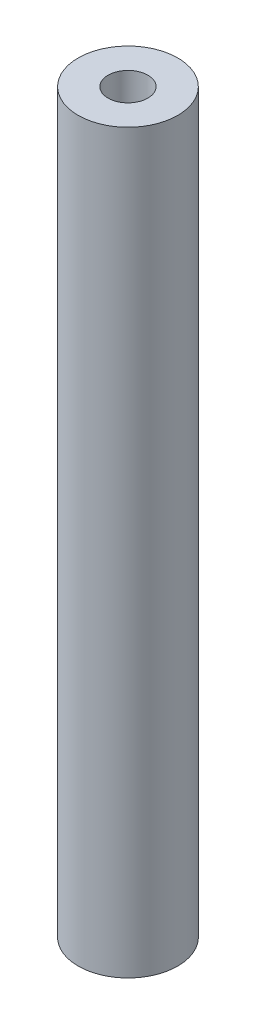
ISO-10303-21;
HEADER;
FILE_DESCRIPTION(('STEP AP214'),'2;1');
FILE_NAME('part.step','',(''),(''),'','','');
FILE_SCHEMA(('AUTOMOTIVE_DESIGN { 1 0 10303 214 1 1 1 1 }'));
ENDSEC;
DATA;
#1=APPLICATION_CONTEXT('core data for automotive mechanical design processes');
#2=APPLICATION_PROTOCOL_DEFINITION('international standard','automotive_design',2000,#1);
#3=PRODUCT_CONTEXT('',#1,'mechanical');
#4=PRODUCT('Part','Part','',(#3));
#5=PRODUCT_RELATED_PRODUCT_CATEGORY('part','',(#4));
#6=PRODUCT_DEFINITION_FORMATION('','',#4);
#7=PRODUCT_DEFINITION_CONTEXT('part definition',#1,'design');
#8=PRODUCT_DEFINITION('design','',#6,#7);
#9=PRODUCT_DEFINITION_SHAPE('','',#8);
#10=(LENGTH_UNIT() NAMED_UNIT(*) SI_UNIT(.MILLI.,.METRE.));
#11=(NAMED_UNIT(*) PLANE_ANGLE_UNIT() SI_UNIT($,.RADIAN.));
#12=(NAMED_UNIT(*) SI_UNIT($,.STERADIAN.) SOLID_ANGLE_UNIT());
#13=UNCERTAINTY_MEASURE_WITH_UNIT(LENGTH_MEASURE(1.E-05),#10,'distance_accuracy_value','');
#14=(GEOMETRIC_REPRESENTATION_CONTEXT(3) GLOBAL_UNCERTAINTY_ASSIGNED_CONTEXT((#13)) GLOBAL_UNIT_ASSIGNED_CONTEXT((#10,
#11,#12)) REPRESENTATION_CONTEXT('',''));
#15=CARTESIAN_POINT('',(0.,0.,0.));
#16=DIRECTION('',(0.,0.,1.));
#17=DIRECTION('',(1.,0.,0.));
#18=AXIS2_PLACEMENT_3D('',#15,#16,#17);
#19=CARTESIAN_POINT('',(0.,74.,0.));
#20=DIRECTION('',(0.,-1.,0.));
#21=DIRECTION('',(0.,0.,-1.));
#22=AXIS2_PLACEMENT_3D('',#19,#20,#21);
#23=CYLINDRICAL_SURFACE('',#22,5.);
#24=CARTESIAN_POINT('',(0.,74.,0.));
#25=DIRECTION('',(0.,1.,0.));
#26=DIRECTION('',(0.,0.,1.));
#27=AXIS2_PLACEMENT_3D('',#24,#25,#26);
#28=CIRCLE('',#27,5.);
#29=CARTESIAN_POINT('',(0.,74.,5.));
#30=VERTEX_POINT('',#29);
#31=EDGE_CURVE('E10',#30,#30,#28,.T.);
#32=ORIENTED_EDGE('',*,*,#31,.F.);
#33=EDGE_LOOP('',(#32));
#34=FACE_BOUND('',#33,.T.);
#35=CARTESIAN_POINT('',(0.,0.,0.));
#36=DIRECTION('',(0.,1.,0.));
#37=DIRECTION('',(0.,0.,1.));
#38=AXIS2_PLACEMENT_3D('',#35,#36,#37);
#39=CIRCLE('',#38,5.);
#40=CARTESIAN_POINT('',(0.,0.,5.));
#41=VERTEX_POINT('',#40);
#42=EDGE_CURVE('E34',#41,#41,#39,.T.);
#43=ORIENTED_EDGE('',*,*,#42,.T.);
#44=EDGE_LOOP('',(#43));
#45=FACE_BOUND('',#44,.T.);
#46=ADVANCED_FACE('F31',(#34,#45),#23,.T.);
#47=CARTESIAN_POINT('',(0.,74.,0.));
#48=DIRECTION('',(0.,1.,0.));
#49=DIRECTION('',(0.,0.,1.));
#50=AXIS2_PLACEMENT_3D('',#47,#48,#49);
#51=PLANE('',#50);
#52=CARTESIAN_POINT('',(0.,74.,0.));
#53=DIRECTION('',(0.,1.,0.));
#54=DIRECTION('',(0.,0.,1.));
#55=AXIS2_PLACEMENT_3D('',#52,#53,#54);
#56=CIRCLE('',#55,2.);
#57=CARTESIAN_POINT('',(0.,74.,2.));
#58=VERTEX_POINT('',#57);
#59=EDGE_CURVE('E45',#58,#58,#56,.T.);
#60=ORIENTED_EDGE('',*,*,#59,.F.);
#61=EDGE_LOOP('',(#60));
#62=FACE_BOUND('',#61,.T.);
#63=ORIENTED_EDGE('',*,*,#31,.T.);
#64=EDGE_LOOP('',(#63));
#65=FACE_BOUND('',#64,.T.);
#66=ADVANCED_FACE('F52',(#62,#65),#51,.T.);
#67=CARTESIAN_POINT('',(0.,0.,0.));
#68=DIRECTION('',(0.,1.,0.));
#69=DIRECTION('',(0.,0.,1.));
#70=AXIS2_PLACEMENT_3D('',#67,#68,#69);
#71=PLANE('',#70);
#72=CARTESIAN_POINT('',(0.,0.,0.));
#73=DIRECTION('',(0.,1.,0.));
#74=DIRECTION('',(0.,0.,1.));
#75=AXIS2_PLACEMENT_3D('',#72,#73,#74);
#76=CIRCLE('',#75,2.);
#77=CARTESIAN_POINT('',(0.,0.,2.));
#78=VERTEX_POINT('',#77);
#79=EDGE_CURVE('E41',#78,#78,#76,.F.);
#80=ORIENTED_EDGE('',*,*,#79,.F.);
#81=EDGE_LOOP('',(#80));
#82=FACE_BOUND('',#81,.T.);
#83=ORIENTED_EDGE('',*,*,#42,.F.);
#84=EDGE_LOOP('',(#83));
#85=FACE_BOUND('',#84,.T.);
#86=ADVANCED_FACE('F54',(#82,#85),#71,.F.);
#87=CARTESIAN_POINT('',(0.,-0.001000000000001,0.));
#88=DIRECTION('',(0.,1.,0.));
#89=DIRECTION('',(0.,0.,1.));
#90=AXIS2_PLACEMENT_3D('',#87,#88,#89);
#91=CYLINDRICAL_SURFACE('',#90,2.);
#92=ORIENTED_EDGE('',*,*,#59,.T.);
#93=EDGE_LOOP('',(#92));
#94=FACE_BOUND('',#93,.T.);
#95=ORIENTED_EDGE('',*,*,#79,.T.);
#96=EDGE_LOOP('',(#95));
#97=FACE_BOUND('',#96,.T.);
#98=ADVANCED_FACE('F49',(#94,#97),#91,.F.);
#99=CLOSED_SHELL('',(#46,#66,#86,#98));
#100=MANIFOLD_SOLID_BREP('B2',#99);
#101=ADVANCED_BREP_SHAPE_REPRESENTATION('',(#18,#100),#14);
#102=SHAPE_DEFINITION_REPRESENTATION(#9,#101);
ENDSEC;
END-ISO-10303-21;
